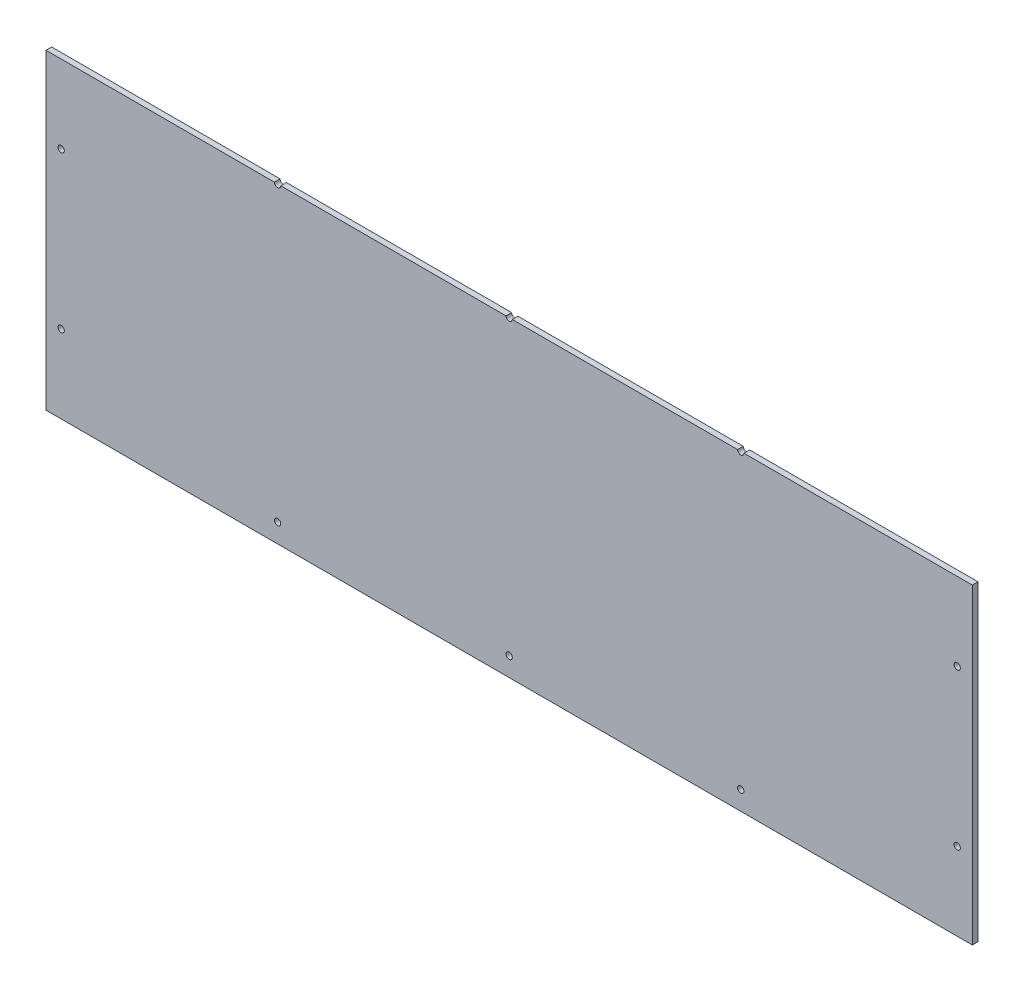
ISO-10303-21;
HEADER;
FILE_DESCRIPTION(('STEP AP214'),'2;1');
FILE_NAME('part.step','',(''),(''),'','','');
FILE_SCHEMA(('AUTOMOTIVE_DESIGN { 1 0 10303 214 1 1 1 1 }'));
ENDSEC;
DATA;
#1=APPLICATION_CONTEXT('core data for automotive mechanical design processes');
#2=APPLICATION_PROTOCOL_DEFINITION('international standard','automotive_design',2000,#1);
#3=PRODUCT_CONTEXT('',#1,'mechanical');
#4=PRODUCT('Part','Part','',(#3));
#5=PRODUCT_RELATED_PRODUCT_CATEGORY('part','',(#4));
#6=PRODUCT_DEFINITION_FORMATION('','',#4);
#7=PRODUCT_DEFINITION_CONTEXT('part definition',#1,'design');
#8=PRODUCT_DEFINITION('design','',#6,#7);
#9=PRODUCT_DEFINITION_SHAPE('','',#8);
#10=(LENGTH_UNIT() NAMED_UNIT(*) SI_UNIT(.MILLI.,.METRE.));
#11=(NAMED_UNIT(*) PLANE_ANGLE_UNIT() SI_UNIT($,.RADIAN.));
#12=(NAMED_UNIT(*) SI_UNIT($,.STERADIAN.) SOLID_ANGLE_UNIT());
#13=UNCERTAINTY_MEASURE_WITH_UNIT(LENGTH_MEASURE(1.E-05),#10,'distance_accuracy_value','');
#14=(GEOMETRIC_REPRESENTATION_CONTEXT(3) GLOBAL_UNCERTAINTY_ASSIGNED_CONTEXT((#13)) GLOBAL_UNIT_ASSIGNED_CONTEXT((#10,
#11,#12)) REPRESENTATION_CONTEXT('',''));
#15=CARTESIAN_POINT('',(0.,0.,0.));
#16=DIRECTION('',(0.,0.,1.));
#17=DIRECTION('',(1.,0.,0.));
#18=AXIS2_PLACEMENT_3D('',#15,#16,#17);
#19=CARTESIAN_POINT('',(183.5,123.5,4.5));
#20=DIRECTION('',(0.,0.,1.));
#21=DIRECTION('',(1.,0.,0.));
#22=AXIS2_PLACEMENT_3D('',#19,#20,#21);
#23=PLANE('',#22);
#24=CARTESIAN_POINT('',(0.,-108.5,4.5));
#25=DIRECTION('',(0.,0.,1.));
#26=DIRECTION('',(1.,0.,0.));
#27=AXIS2_PLACEMENT_3D('',#24,#25,#26);
#28=CIRCLE('',#27,2.5);
#29=CARTESIAN_POINT('',(2.49999999999994,-108.5,4.5));
#30=VERTEX_POINT('',#29);
#31=EDGE_CURVE('E240',#30,#30,#28,.T.);
#32=ORIENTED_EDGE('',*,*,#31,.F.);
#33=EDGE_LOOP('',(#32));
#34=FACE_BOUND('',#33,.T.);
#35=CARTESIAN_POINT('',(355.,61.75,4.5));
#36=DIRECTION('',(0.,0.,1.));
#37=DIRECTION('',(-1.,0.,0.));
#38=AXIS2_PLACEMENT_3D('',#35,#36,#37);
#39=CIRCLE('',#38,2.50000000000002);
#40=CARTESIAN_POINT('',(352.5,61.75,4.5));
#41=VERTEX_POINT('',#40);
#42=EDGE_CURVE('E228',#41,#41,#39,.T.);
#43=ORIENTED_EDGE('',*,*,#42,.F.);
#44=EDGE_LOOP('',(#43));
#45=FACE_BOUND('',#44,.T.);
#46=CARTESIAN_POINT('',(354.999999999999,-61.7500000000001,4.5));
#47=DIRECTION('',(0.,0.,1.));
#48=DIRECTION('',(-1.,0.,0.));
#49=AXIS2_PLACEMENT_3D('',#46,#47,#48);
#50=CIRCLE('',#49,2.50000000000002);
#51=CARTESIAN_POINT('',(352.499999999999,-61.7500000000001,4.5));
#52=VERTEX_POINT('',#51);
#53=EDGE_CURVE('E216',#52,#52,#50,.T.);
#54=ORIENTED_EDGE('',*,*,#53,.F.);
#55=EDGE_LOOP('',(#54));
#56=FACE_BOUND('',#55,.T.);
#57=DIRECTION('',(0.,-1.,0.));
#58=VECTOR('',#57,1.);
#59=CARTESIAN_POINT('',(-367.,123.5,4.5));
#60=LINE('',#59,#58);
#61=CARTESIAN_POINT('',(-367.,123.5,4.5));
#62=VERTEX_POINT('',#61);
#63=CARTESIAN_POINT('',(-367.,-123.5,4.5));
#64=VERTEX_POINT('',#63);
#65=EDGE_CURVE('E165',#62,#64,#60,.T.);
#66=ORIENTED_EDGE('',*,*,#65,.T.);
#67=DIRECTION('',(1.,0.,0.));
#68=VECTOR('',#67,1.);
#69=CARTESIAN_POINT('',(-367.,-123.5,4.5));
#70=LINE('',#69,#68);
#71=CARTESIAN_POINT('',(367.,-123.5,4.5));
#72=VERTEX_POINT('',#71);
#73=EDGE_CURVE('E103',#64,#72,#70,.T.);
#74=ORIENTED_EDGE('',*,*,#73,.T.);
#75=DIRECTION('',(0.,1.,0.));
#76=VECTOR('',#75,1.);
#77=CARTESIAN_POINT('',(367.,123.5,4.5));
#78=LINE('',#77,#76);
#79=CARTESIAN_POINT('',(367.,123.5,4.5));
#80=VERTEX_POINT('',#79);
#81=EDGE_CURVE('E186',#72,#80,#78,.T.);
#82=ORIENTED_EDGE('',*,*,#81,.T.);
#83=DIRECTION('',(-1.,0.,0.));
#84=VECTOR('',#83,1.);
#85=CARTESIAN_POINT('',(186.,123.5,4.5));
#86=LINE('',#85,#84);
#87=CARTESIAN_POINT('',(186.,123.5,4.5));
#88=VERTEX_POINT('',#87);
#89=EDGE_CURVE('E205',#80,#88,#86,.T.);
#90=ORIENTED_EDGE('',*,*,#89,.T.);
#91=CARTESIAN_POINT('',(183.5,123.5,4.5));
#92=DIRECTION('',(0.,0.,-1.));
#93=DIRECTION('',(1.,0.,0.));
#94=AXIS2_PLACEMENT_3D('',#91,#92,#93);
#95=CIRCLE('',#94,2.5);
#96=CARTESIAN_POINT('',(181.,123.5,4.5));
#97=VERTEX_POINT('',#96);
#98=EDGE_CURVE('E202',#88,#97,#95,.T.);
#99=ORIENTED_EDGE('',*,*,#98,.T.);
#100=DIRECTION('',(-1.,0.,0.));
#101=VECTOR('',#100,1.);
#102=CARTESIAN_POINT('',(2.5,123.5,4.5));
#103=LINE('',#102,#101);
#104=CARTESIAN_POINT('',(2.5,123.5,4.5));
#105=VERTEX_POINT('',#104);
#106=EDGE_CURVE('E204',#97,#105,#103,.T.);
#107=ORIENTED_EDGE('',*,*,#106,.T.);
#108=CARTESIAN_POINT('',(0.,123.5,4.5));
#109=DIRECTION('',(0.,0.,-1.));
#110=DIRECTION('',(1.,0.,0.));
#111=AXIS2_PLACEMENT_3D('',#108,#109,#110);
#112=CIRCLE('',#111,2.5);
#113=CARTESIAN_POINT('',(-2.5,123.5,4.5));
#114=VERTEX_POINT('',#113);
#115=EDGE_CURVE('E128',#105,#114,#112,.T.);
#116=ORIENTED_EDGE('',*,*,#115,.T.);
#117=DIRECTION('',(-1.,0.,0.));
#118=VECTOR('',#117,1.);
#119=CARTESIAN_POINT('',(-181.,123.5,4.5));
#120=LINE('',#119,#118);
#121=CARTESIAN_POINT('',(-181.,123.499999999999,4.5));
#122=VERTEX_POINT('',#121);
#123=EDGE_CURVE('E122',#114,#122,#120,.T.);
#124=ORIENTED_EDGE('',*,*,#123,.T.);
#125=CARTESIAN_POINT('',(-183.5,123.499999999999,4.5));
#126=DIRECTION('',(0.,0.,-1.));
#127=DIRECTION('',(1.,0.,0.));
#128=AXIS2_PLACEMENT_3D('',#125,#126,#127);
#129=CIRCLE('',#128,2.5);
#130=CARTESIAN_POINT('',(-186.,123.5,4.5));
#131=VERTEX_POINT('',#130);
#132=EDGE_CURVE('E126',#122,#131,#129,.T.);
#133=ORIENTED_EDGE('',*,*,#132,.T.);
#134=DIRECTION('',(-1.,0.,0.));
#135=VECTOR('',#134,1.);
#136=CARTESIAN_POINT('',(-367.,123.5,4.5));
#137=LINE('',#136,#135);
#138=EDGE_CURVE('E54',#131,#62,#137,.T.);
#139=ORIENTED_EDGE('',*,*,#138,.T.);
#140=EDGE_LOOP('',(#66,#74,#82,#90,#99,#107,#116,#124,#133,#139));
#141=FACE_BOUND('',#140,.T.);
#142=CARTESIAN_POINT('',(-355.,61.75,4.5));
#143=DIRECTION('',(0.,0.,1.));
#144=DIRECTION('',(1.,0.,0.));
#145=AXIS2_PLACEMENT_3D('',#142,#143,#144);
#146=CIRCLE('',#145,2.50000000000002);
#147=CARTESIAN_POINT('',(-352.5,61.75,4.5));
#148=VERTEX_POINT('',#147);
#149=EDGE_CURVE('E150',#148,#148,#146,.T.);
#150=ORIENTED_EDGE('',*,*,#149,.F.);
#151=EDGE_LOOP('',(#150));
#152=FACE_BOUND('',#151,.T.);
#153=CARTESIAN_POINT('',(-354.999999999999,-61.75,4.5));
#154=DIRECTION('',(0.,0.,1.));
#155=DIRECTION('',(1.,0.,0.));
#156=AXIS2_PLACEMENT_3D('',#153,#154,#155);
#157=CIRCLE('',#156,2.50000000000002);
#158=CARTESIAN_POINT('',(-352.499999999999,-61.75,4.5));
#159=VERTEX_POINT('',#158);
#160=EDGE_CURVE('E222',#159,#159,#157,.T.);
#161=ORIENTED_EDGE('',*,*,#160,.F.);
#162=EDGE_LOOP('',(#161));
#163=FACE_BOUND('',#162,.T.);
#164=CARTESIAN_POINT('',(-183.5,-108.5,4.5));
#165=DIRECTION('',(0.,0.,1.));
#166=DIRECTION('',(1.,0.,0.));
#167=AXIS2_PLACEMENT_3D('',#164,#165,#166);
#168=CIRCLE('',#167,2.5);
#169=CARTESIAN_POINT('',(-181.,-108.5,4.5));
#170=VERTEX_POINT('',#169);
#171=EDGE_CURVE('E234',#170,#170,#168,.T.);
#172=ORIENTED_EDGE('',*,*,#171,.F.);
#173=EDGE_LOOP('',(#172));
#174=FACE_BOUND('',#173,.T.);
#175=CARTESIAN_POINT('',(183.5,-108.5,4.5));
#176=DIRECTION('',(0.,0.,1.));
#177=DIRECTION('',(1.,0.,0.));
#178=AXIS2_PLACEMENT_3D('',#175,#176,#177);
#179=CIRCLE('',#178,2.5);
#180=CARTESIAN_POINT('',(186.,-108.5,4.5));
#181=VERTEX_POINT('',#180);
#182=EDGE_CURVE('E246',#181,#181,#179,.T.);
#183=ORIENTED_EDGE('',*,*,#182,.F.);
#184=EDGE_LOOP('',(#183));
#185=FACE_BOUND('',#184,.T.);
#186=ADVANCED_FACE('F37',(#34,#45,#56,#141,#152,#163,#174,#185),#23,.T.);
#187=CARTESIAN_POINT('',(183.5,123.5,0.));
#188=DIRECTION('',(0.,0.,1.));
#189=DIRECTION('',(1.,0.,0.));
#190=AXIS2_PLACEMENT_3D('',#187,#188,#189);
#191=PLANE('',#190);
#192=DIRECTION('',(0.,-1.,0.));
#193=VECTOR('',#192,1.);
#194=CARTESIAN_POINT('',(-367.,123.5,0.));
#195=LINE('',#194,#193);
#196=CARTESIAN_POINT('',(-367.,123.5,0.));
#197=VERTEX_POINT('',#196);
#198=CARTESIAN_POINT('',(-367.,-123.5,0.));
#199=VERTEX_POINT('',#198);
#200=EDGE_CURVE('E146',#197,#199,#195,.T.);
#201=ORIENTED_EDGE('',*,*,#200,.F.);
#202=DIRECTION('',(-1.,0.,0.));
#203=VECTOR('',#202,1.);
#204=CARTESIAN_POINT('',(-367.,123.5,0.));
#205=LINE('',#204,#203);
#206=CARTESIAN_POINT('',(-186.,123.5,0.));
#207=VERTEX_POINT('',#206);
#208=EDGE_CURVE('E95',#207,#197,#205,.T.);
#209=ORIENTED_EDGE('',*,*,#208,.F.);
#210=CARTESIAN_POINT('',(-183.5,123.499999999999,0.));
#211=DIRECTION('',(0.,0.,-1.));
#212=DIRECTION('',(1.,0.,0.));
#213=AXIS2_PLACEMENT_3D('',#210,#211,#212);
#214=CIRCLE('',#213,2.5);
#215=CARTESIAN_POINT('',(-181.,123.499999999999,0.));
#216=VERTEX_POINT('',#215);
#217=EDGE_CURVE('E89',#216,#207,#214,.T.);
#218=ORIENTED_EDGE('',*,*,#217,.F.);
#219=DIRECTION('',(-1.,0.,0.));
#220=VECTOR('',#219,1.);
#221=CARTESIAN_POINT('',(-181.,123.5,0.));
#222=LINE('',#221,#220);
#223=CARTESIAN_POINT('',(-2.5,123.5,0.));
#224=VERTEX_POINT('',#223);
#225=EDGE_CURVE('E136',#224,#216,#222,.T.);
#226=ORIENTED_EDGE('',*,*,#225,.F.);
#227=CARTESIAN_POINT('',(0.,123.5,0.));
#228=DIRECTION('',(0.,0.,-1.));
#229=DIRECTION('',(1.,0.,0.));
#230=AXIS2_PLACEMENT_3D('',#227,#228,#229);
#231=CIRCLE('',#230,2.5);
#232=CARTESIAN_POINT('',(2.5,123.5,0.));
#233=VERTEX_POINT('',#232);
#234=EDGE_CURVE('E160',#233,#224,#231,.T.);
#235=ORIENTED_EDGE('',*,*,#234,.F.);
#236=DIRECTION('',(-1.,0.,0.));
#237=VECTOR('',#236,1.);
#238=CARTESIAN_POINT('',(2.5,123.5,0.));
#239=LINE('',#238,#237);
#240=CARTESIAN_POINT('',(181.,123.5,0.));
#241=VERTEX_POINT('',#240);
#242=EDGE_CURVE('E158',#241,#233,#239,.T.);
#243=ORIENTED_EDGE('',*,*,#242,.F.);
#244=CARTESIAN_POINT('',(183.5,123.5,0.));
#245=DIRECTION('',(0.,0.,-1.));
#246=DIRECTION('',(1.,0.,0.));
#247=AXIS2_PLACEMENT_3D('',#244,#245,#246);
#248=CIRCLE('',#247,2.5);
#249=CARTESIAN_POINT('',(186.,123.5,0.));
#250=VERTEX_POINT('',#249);
#251=EDGE_CURVE('E156',#250,#241,#248,.T.);
#252=ORIENTED_EDGE('',*,*,#251,.F.);
#253=DIRECTION('',(-1.,0.,0.));
#254=VECTOR('',#253,1.);
#255=CARTESIAN_POINT('',(186.,123.5,0.));
#256=LINE('',#255,#254);
#257=CARTESIAN_POINT('',(367.,123.5,0.));
#258=VERTEX_POINT('',#257);
#259=EDGE_CURVE('E154',#258,#250,#256,.T.);
#260=ORIENTED_EDGE('',*,*,#259,.F.);
#261=DIRECTION('',(0.,1.,0.));
#262=VECTOR('',#261,1.);
#263=CARTESIAN_POINT('',(367.,123.5,0.));
#264=LINE('',#263,#262);
#265=CARTESIAN_POINT('',(367.,-123.5,0.));
#266=VERTEX_POINT('',#265);
#267=EDGE_CURVE('E152',#266,#258,#264,.T.);
#268=ORIENTED_EDGE('',*,*,#267,.F.);
#269=DIRECTION('',(1.,0.,0.));
#270=VECTOR('',#269,1.);
#271=CARTESIAN_POINT('',(-367.,-123.5,0.));
#272=LINE('',#271,#270);
#273=EDGE_CURVE('E149',#199,#266,#272,.T.);
#274=ORIENTED_EDGE('',*,*,#273,.F.);
#275=EDGE_LOOP('',(#201,#209,#218,#226,#235,#243,#252,#260,#268,#274));
#276=FACE_BOUND('',#275,.T.);
#277=CARTESIAN_POINT('',(-355.,61.75,0.));
#278=DIRECTION('',(0.,0.,1.));
#279=DIRECTION('',(1.,0.,0.));
#280=AXIS2_PLACEMENT_3D('',#277,#278,#279);
#281=CIRCLE('',#280,2.50000000000002);
#282=CARTESIAN_POINT('',(-352.5,61.75,0.));
#283=VERTEX_POINT('',#282);
#284=EDGE_CURVE('E213',#283,#283,#281,.T.);
#285=ORIENTED_EDGE('',*,*,#284,.T.);
#286=EDGE_LOOP('',(#285));
#287=FACE_BOUND('',#286,.T.);
#288=CARTESIAN_POINT('',(354.999999999999,-61.7500000000001,0.));
#289=DIRECTION('',(0.,0.,1.));
#290=DIRECTION('',(-1.,0.,0.));
#291=AXIS2_PLACEMENT_3D('',#288,#289,#290);
#292=CIRCLE('',#291,2.50000000000002);
#293=CARTESIAN_POINT('',(352.499999999999,-61.7500000000001,0.));
#294=VERTEX_POINT('',#293);
#295=EDGE_CURVE('E219',#294,#294,#292,.T.);
#296=ORIENTED_EDGE('',*,*,#295,.T.);
#297=EDGE_LOOP('',(#296));
#298=FACE_BOUND('',#297,.T.);
#299=CARTESIAN_POINT('',(-354.999999999999,-61.75,0.));
#300=DIRECTION('',(0.,0.,1.));
#301=DIRECTION('',(1.,0.,0.));
#302=AXIS2_PLACEMENT_3D('',#299,#300,#301);
#303=CIRCLE('',#302,2.50000000000002);
#304=CARTESIAN_POINT('',(-352.499999999999,-61.75,0.));
#305=VERTEX_POINT('',#304);
#306=EDGE_CURVE('E225',#305,#305,#303,.T.);
#307=ORIENTED_EDGE('',*,*,#306,.T.);
#308=EDGE_LOOP('',(#307));
#309=FACE_BOUND('',#308,.T.);
#310=CARTESIAN_POINT('',(355.,61.75,0.));
#311=DIRECTION('',(0.,0.,1.));
#312=DIRECTION('',(-1.,0.,0.));
#313=AXIS2_PLACEMENT_3D('',#310,#311,#312);
#314=CIRCLE('',#313,2.50000000000002);
#315=CARTESIAN_POINT('',(352.5,61.75,0.));
#316=VERTEX_POINT('',#315);
#317=EDGE_CURVE('E231',#316,#316,#314,.T.);
#318=ORIENTED_EDGE('',*,*,#317,.T.);
#319=EDGE_LOOP('',(#318));
#320=FACE_BOUND('',#319,.T.);
#321=CARTESIAN_POINT('',(-183.5,-108.5,0.));
#322=DIRECTION('',(0.,0.,1.));
#323=DIRECTION('',(1.,0.,0.));
#324=AXIS2_PLACEMENT_3D('',#321,#322,#323);
#325=CIRCLE('',#324,2.5);
#326=CARTESIAN_POINT('',(-181.,-108.5,0.));
#327=VERTEX_POINT('',#326);
#328=EDGE_CURVE('E237',#327,#327,#325,.T.);
#329=ORIENTED_EDGE('',*,*,#328,.T.);
#330=EDGE_LOOP('',(#329));
#331=FACE_BOUND('',#330,.T.);
#332=CARTESIAN_POINT('',(0.,-108.5,0.));
#333=DIRECTION('',(0.,0.,1.));
#334=DIRECTION('',(1.,0.,0.));
#335=AXIS2_PLACEMENT_3D('',#332,#333,#334);
#336=CIRCLE('',#335,2.5);
#337=CARTESIAN_POINT('',(2.49999999999994,-108.5,0.));
#338=VERTEX_POINT('',#337);
#339=EDGE_CURVE('E243',#338,#338,#336,.T.);
#340=ORIENTED_EDGE('',*,*,#339,.T.);
#341=EDGE_LOOP('',(#340));
#342=FACE_BOUND('',#341,.T.);
#343=CARTESIAN_POINT('',(183.5,-108.5,0.));
#344=DIRECTION('',(0.,0.,1.));
#345=DIRECTION('',(1.,0.,0.));
#346=AXIS2_PLACEMENT_3D('',#343,#344,#345);
#347=CIRCLE('',#346,2.5);
#348=CARTESIAN_POINT('',(186.,-108.5,0.));
#349=VERTEX_POINT('',#348);
#350=EDGE_CURVE('E249',#349,#349,#347,.T.);
#351=ORIENTED_EDGE('',*,*,#350,.T.);
#352=EDGE_LOOP('',(#351));
#353=FACE_BOUND('',#352,.T.);
#354=ADVANCED_FACE('F190',(#276,#287,#298,#309,#320,#331,#342,#353),#191,.F.);
#355=CARTESIAN_POINT('',(-367.,123.5,4.5));
#356=DIRECTION('',(1.,0.,0.));
#357=DIRECTION('',(0.,1.,0.));
#358=AXIS2_PLACEMENT_3D('',#355,#356,#357);
#359=PLANE('',#358);
#360=ORIENTED_EDGE('',*,*,#200,.T.);
#361=DIRECTION('',(0.,0.,-1.));
#362=VECTOR('',#361,1.);
#363=CARTESIAN_POINT('',(-367.,-123.5,4.5));
#364=LINE('',#363,#362);
#365=EDGE_CURVE('E11',#64,#199,#364,.T.);
#366=ORIENTED_EDGE('',*,*,#365,.F.);
#367=ORIENTED_EDGE('',*,*,#65,.F.);
#368=DIRECTION('',(0.,0.,-1.));
#369=VECTOR('',#368,1.);
#370=CARTESIAN_POINT('',(-367.,123.5,4.5));
#371=LINE('',#370,#369);
#372=EDGE_CURVE('E142',#62,#197,#371,.T.);
#373=ORIENTED_EDGE('',*,*,#372,.T.);
#374=EDGE_LOOP('',(#360,#366,#367,#373));
#375=FACE_BOUND('',#374,.T.);
#376=ADVANCED_FACE('F39',(#375),#359,.F.);
#377=CARTESIAN_POINT('',(-367.,-123.5,4.5));
#378=DIRECTION('',(0.,1.,0.));
#379=DIRECTION('',(0.,0.,1.));
#380=AXIS2_PLACEMENT_3D('',#377,#378,#379);
#381=PLANE('',#380);
#382=ORIENTED_EDGE('',*,*,#273,.T.);
#383=DIRECTION('',(0.,0.,-1.));
#384=VECTOR('',#383,1.);
#385=CARTESIAN_POINT('',(367.,-123.5,4.5));
#386=LINE('',#385,#384);
#387=EDGE_CURVE('E46',#72,#266,#386,.T.);
#388=ORIENTED_EDGE('',*,*,#387,.F.);
#389=ORIENTED_EDGE('',*,*,#73,.F.);
#390=ORIENTED_EDGE('',*,*,#365,.T.);
#391=EDGE_LOOP('',(#382,#388,#389,#390));
#392=FACE_BOUND('',#391,.T.);
#393=ADVANCED_FACE('F291',(#392),#381,.F.);
#394=CARTESIAN_POINT('',(367.,123.5,4.5));
#395=DIRECTION('',(-1.,0.,0.));
#396=DIRECTION('',(0.,0.,1.));
#397=AXIS2_PLACEMENT_3D('',#394,#395,#396);
#398=PLANE('',#397);
#399=ORIENTED_EDGE('',*,*,#267,.T.);
#400=DIRECTION('',(0.,0.,-1.));
#401=VECTOR('',#400,1.);
#402=CARTESIAN_POINT('',(367.,123.5,4.5));
#403=LINE('',#402,#401);
#404=EDGE_CURVE('E178',#80,#258,#403,.T.);
#405=ORIENTED_EDGE('',*,*,#404,.F.);
#406=ORIENTED_EDGE('',*,*,#81,.F.);
#407=ORIENTED_EDGE('',*,*,#387,.T.);
#408=EDGE_LOOP('',(#399,#405,#406,#407));
#409=FACE_BOUND('',#408,.T.);
#410=ADVANCED_FACE('F184',(#409),#398,.F.);
#411=CARTESIAN_POINT('',(186.,123.5,4.5));
#412=DIRECTION('',(0.,-1.,0.));
#413=DIRECTION('',(0.,0.,-1.));
#414=AXIS2_PLACEMENT_3D('',#411,#412,#413);
#415=PLANE('',#414);
#416=ORIENTED_EDGE('',*,*,#259,.T.);
#417=DIRECTION('',(0.,0.,-1.));
#418=VECTOR('',#417,1.);
#419=CARTESIAN_POINT('',(186.,123.5,4.5));
#420=LINE('',#419,#418);
#421=EDGE_CURVE('E175',#88,#250,#420,.T.);
#422=ORIENTED_EDGE('',*,*,#421,.F.);
#423=ORIENTED_EDGE('',*,*,#89,.F.);
#424=ORIENTED_EDGE('',*,*,#404,.T.);
#425=EDGE_LOOP('',(#416,#422,#423,#424));
#426=FACE_BOUND('',#425,.T.);
#427=ADVANCED_FACE('F196',(#426),#415,.F.);
#428=CARTESIAN_POINT('',(183.5,123.5,4.5));
#429=DIRECTION('',(0.,0.,-1.));
#430=DIRECTION('',(-1.,0.,0.));
#431=AXIS2_PLACEMENT_3D('',#428,#429,#430);
#432=CYLINDRICAL_SURFACE('',#431,2.5);
#433=ORIENTED_EDGE('',*,*,#251,.T.);
#434=DIRECTION('',(0.,0.,-1.));
#435=VECTOR('',#434,1.);
#436=CARTESIAN_POINT('',(181.,123.5,4.5));
#437=LINE('',#436,#435);
#438=EDGE_CURVE('E172',#97,#241,#437,.T.);
#439=ORIENTED_EDGE('',*,*,#438,.F.);
#440=ORIENTED_EDGE('',*,*,#98,.F.);
#441=ORIENTED_EDGE('',*,*,#421,.T.);
#442=EDGE_LOOP('',(#433,#439,#440,#441));
#443=FACE_BOUND('',#442,.T.);
#444=ADVANCED_FACE('F200',(#443),#432,.F.);
#445=CARTESIAN_POINT('',(2.5,123.5,4.5));
#446=DIRECTION('',(0.,-1.,0.));
#447=DIRECTION('',(0.,0.,-1.));
#448=AXIS2_PLACEMENT_3D('',#445,#446,#447);
#449=PLANE('',#448);
#450=ORIENTED_EDGE('',*,*,#242,.T.);
#451=DIRECTION('',(0.,0.,-1.));
#452=VECTOR('',#451,1.);
#453=CARTESIAN_POINT('',(2.5,123.5,4.5));
#454=LINE('',#453,#452);
#455=EDGE_CURVE('E169',#105,#233,#454,.T.);
#456=ORIENTED_EDGE('',*,*,#455,.F.);
#457=ORIENTED_EDGE('',*,*,#106,.F.);
#458=ORIENTED_EDGE('',*,*,#438,.T.);
#459=EDGE_LOOP('',(#450,#456,#457,#458));
#460=FACE_BOUND('',#459,.T.);
#461=ADVANCED_FACE('F281',(#460),#449,.F.);
#462=CARTESIAN_POINT('',(0.,123.5,4.5));
#463=DIRECTION('',(0.,0.,-1.));
#464=DIRECTION('',(-1.,0.,0.));
#465=AXIS2_PLACEMENT_3D('',#462,#463,#464);
#466=CYLINDRICAL_SURFACE('',#465,2.5);
#467=ORIENTED_EDGE('',*,*,#234,.T.);
#468=DIRECTION('',(0.,0.,-1.));
#469=VECTOR('',#468,1.);
#470=CARTESIAN_POINT('',(-2.5,123.5,4.5));
#471=LINE('',#470,#469);
#472=EDGE_CURVE('E137',#114,#224,#471,.T.);
#473=ORIENTED_EDGE('',*,*,#472,.F.);
#474=ORIENTED_EDGE('',*,*,#115,.F.);
#475=ORIENTED_EDGE('',*,*,#455,.T.);
#476=EDGE_LOOP('',(#467,#473,#474,#475));
#477=FACE_BOUND('',#476,.T.);
#478=ADVANCED_FACE('F278',(#477),#466,.F.);
#479=CARTESIAN_POINT('',(-181.,123.5,4.5));
#480=DIRECTION('',(0.,-1.,0.));
#481=DIRECTION('',(0.,0.,-1.));
#482=AXIS2_PLACEMENT_3D('',#479,#480,#481);
#483=PLANE('',#482);
#484=ORIENTED_EDGE('',*,*,#225,.T.);
#485=DIRECTION('',(0.,0.,-1.));
#486=VECTOR('',#485,1.);
#487=CARTESIAN_POINT('',(-181.,123.499999999999,4.5));
#488=LINE('',#487,#486);
#489=EDGE_CURVE('E133',#122,#216,#488,.T.);
#490=ORIENTED_EDGE('',*,*,#489,.F.);
#491=ORIENTED_EDGE('',*,*,#123,.F.);
#492=ORIENTED_EDGE('',*,*,#472,.T.);
#493=EDGE_LOOP('',(#484,#490,#491,#492));
#494=FACE_BOUND('',#493,.T.);
#495=ADVANCED_FACE('F134',(#494),#483,.F.);
#496=CARTESIAN_POINT('',(-183.5,123.499999999999,4.5));
#497=DIRECTION('',(0.,0.,-1.));
#498=DIRECTION('',(-1.,0.,0.));
#499=AXIS2_PLACEMENT_3D('',#496,#497,#498);
#500=CYLINDRICAL_SURFACE('',#499,2.5);
#501=ORIENTED_EDGE('',*,*,#217,.T.);
#502=DIRECTION('',(0.,0.,-1.));
#503=VECTOR('',#502,1.);
#504=CARTESIAN_POINT('',(-186.,123.5,4.5));
#505=LINE('',#504,#503);
#506=EDGE_CURVE('E138',#131,#207,#505,.T.);
#507=ORIENTED_EDGE('',*,*,#506,.F.);
#508=ORIENTED_EDGE('',*,*,#132,.F.);
#509=ORIENTED_EDGE('',*,*,#489,.T.);
#510=EDGE_LOOP('',(#501,#507,#508,#509));
#511=FACE_BOUND('',#510,.T.);
#512=ADVANCED_FACE('F140',(#511),#500,.F.);
#513=CARTESIAN_POINT('',(-367.,123.5,4.5));
#514=DIRECTION('',(0.,-1.,0.));
#515=DIRECTION('',(0.,0.,-1.));
#516=AXIS2_PLACEMENT_3D('',#513,#514,#515);
#517=PLANE('',#516);
#518=ORIENTED_EDGE('',*,*,#208,.T.);
#519=ORIENTED_EDGE('',*,*,#372,.F.);
#520=ORIENTED_EDGE('',*,*,#138,.F.);
#521=ORIENTED_EDGE('',*,*,#506,.T.);
#522=EDGE_LOOP('',(#518,#519,#520,#521));
#523=FACE_BOUND('',#522,.T.);
#524=ADVANCED_FACE('F271',(#523),#517,.F.);
#525=CARTESIAN_POINT('',(-355.,61.75,4.5));
#526=DIRECTION('',(0.,0.,-1.));
#527=DIRECTION('',(-1.,0.,0.));
#528=AXIS2_PLACEMENT_3D('',#525,#526,#527);
#529=CYLINDRICAL_SURFACE('',#528,2.50000000000002);
#530=ORIENTED_EDGE('',*,*,#149,.T.);
#531=EDGE_LOOP('',(#530));
#532=FACE_BOUND('',#531,.T.);
#533=ORIENTED_EDGE('',*,*,#284,.F.);
#534=EDGE_LOOP('',(#533));
#535=FACE_BOUND('',#534,.T.);
#536=ADVANCED_FACE('F268',(#532,#535),#529,.F.);
#537=CARTESIAN_POINT('',(354.999999999999,-61.7500000000001,4.5));
#538=DIRECTION('',(0.,0.,-1.));
#539=DIRECTION('',(-1.,0.,0.));
#540=AXIS2_PLACEMENT_3D('',#537,#538,#539);
#541=CYLINDRICAL_SURFACE('',#540,2.50000000000002);
#542=ORIENTED_EDGE('',*,*,#53,.T.);
#543=EDGE_LOOP('',(#542));
#544=FACE_BOUND('',#543,.T.);
#545=ORIENTED_EDGE('',*,*,#295,.F.);
#546=EDGE_LOOP('',(#545));
#547=FACE_BOUND('',#546,.T.);
#548=ADVANCED_FACE('F367',(#544,#547),#541,.F.);
#549=CARTESIAN_POINT('',(-354.999999999999,-61.75,4.5));
#550=DIRECTION('',(0.,0.,-1.));
#551=DIRECTION('',(-1.,0.,0.));
#552=AXIS2_PLACEMENT_3D('',#549,#550,#551);
#553=CYLINDRICAL_SURFACE('',#552,2.50000000000002);
#554=ORIENTED_EDGE('',*,*,#160,.T.);
#555=EDGE_LOOP('',(#554));
#556=FACE_BOUND('',#555,.T.);
#557=ORIENTED_EDGE('',*,*,#306,.F.);
#558=EDGE_LOOP('',(#557));
#559=FACE_BOUND('',#558,.T.);
#560=ADVANCED_FACE('F375',(#556,#559),#553,.F.);
#561=CARTESIAN_POINT('',(355.,61.75,4.5));
#562=DIRECTION('',(0.,0.,-1.));
#563=DIRECTION('',(-1.,0.,0.));
#564=AXIS2_PLACEMENT_3D('',#561,#562,#563);
#565=CYLINDRICAL_SURFACE('',#564,2.50000000000002);
#566=ORIENTED_EDGE('',*,*,#42,.T.);
#567=EDGE_LOOP('',(#566));
#568=FACE_BOUND('',#567,.T.);
#569=ORIENTED_EDGE('',*,*,#317,.F.);
#570=EDGE_LOOP('',(#569));
#571=FACE_BOUND('',#570,.T.);
#572=ADVANCED_FACE('F383',(#568,#571),#565,.F.);
#573=CARTESIAN_POINT('',(-183.5,-108.5,4.5));
#574=DIRECTION('',(0.,0.,-1.));
#575=DIRECTION('',(-1.,0.,0.));
#576=AXIS2_PLACEMENT_3D('',#573,#574,#575);
#577=CYLINDRICAL_SURFACE('',#576,2.5);
#578=ORIENTED_EDGE('',*,*,#171,.T.);
#579=EDGE_LOOP('',(#578));
#580=FACE_BOUND('',#579,.T.);
#581=ORIENTED_EDGE('',*,*,#328,.F.);
#582=EDGE_LOOP('',(#581));
#583=FACE_BOUND('',#582,.T.);
#584=ADVANCED_FACE('F392',(#580,#583),#577,.F.);
#585=CARTESIAN_POINT('',(0.,-108.5,4.5));
#586=DIRECTION('',(0.,0.,-1.));
#587=DIRECTION('',(-1.,0.,0.));
#588=AXIS2_PLACEMENT_3D('',#585,#586,#587);
#589=CYLINDRICAL_SURFACE('',#588,2.5);
#590=ORIENTED_EDGE('',*,*,#31,.T.);
#591=EDGE_LOOP('',(#590));
#592=FACE_BOUND('',#591,.T.);
#593=ORIENTED_EDGE('',*,*,#339,.F.);
#594=EDGE_LOOP('',(#593));
#595=FACE_BOUND('',#594,.T.);
#596=ADVANCED_FACE('F401',(#592,#595),#589,.F.);
#597=CARTESIAN_POINT('',(183.5,-108.5,4.5));
#598=DIRECTION('',(0.,0.,-1.));
#599=DIRECTION('',(-1.,0.,0.));
#600=AXIS2_PLACEMENT_3D('',#597,#598,#599);
#601=CYLINDRICAL_SURFACE('',#600,2.5);
#602=ORIENTED_EDGE('',*,*,#182,.T.);
#603=EDGE_LOOP('',(#602));
#604=FACE_BOUND('',#603,.T.);
#605=ORIENTED_EDGE('',*,*,#350,.F.);
#606=EDGE_LOOP('',(#605));
#607=FACE_BOUND('',#606,.T.);
#608=ADVANCED_FACE('F255',(#604,#607),#601,.F.);
#609=CLOSED_SHELL('',(#186,#354,#376,#393,#410,#427,#444,#461,#478,#495,#512,#524,#536,#548,
#560,#572,#584,#596,#608));
#610=MANIFOLD_SOLID_BREP('B2',#609);
#611=ADVANCED_BREP_SHAPE_REPRESENTATION('',(#18,#610),#14);
#612=SHAPE_DEFINITION_REPRESENTATION(#9,#611);
ENDSEC;
END-ISO-10303-21;
